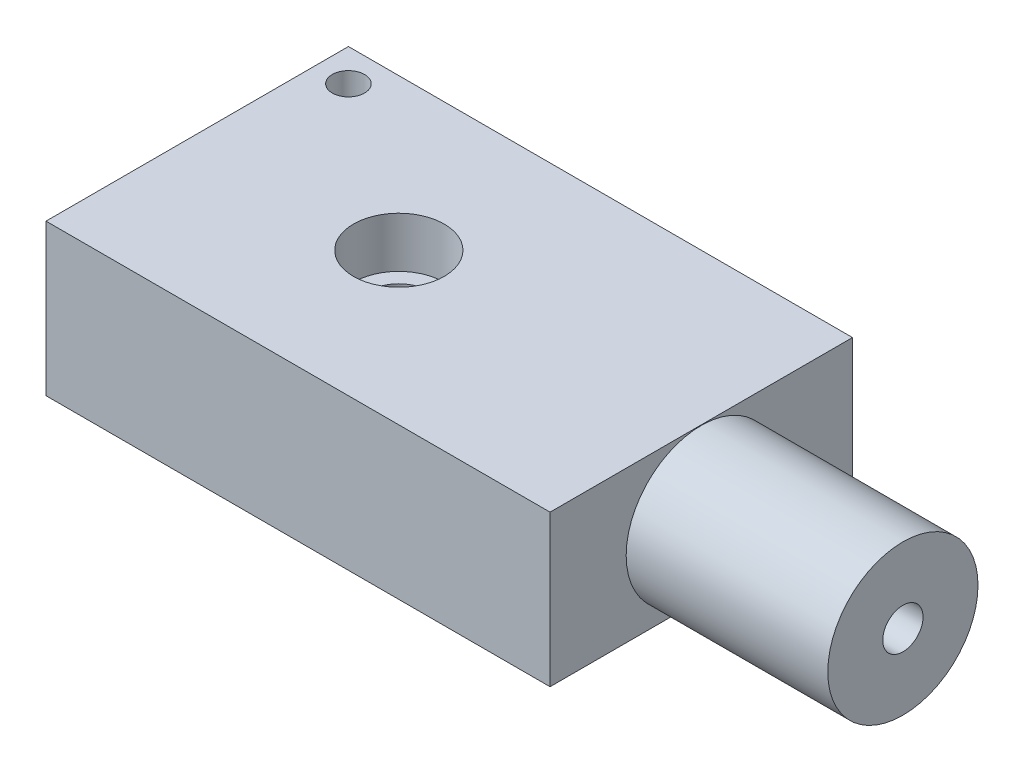
ISO-10303-21;
HEADER;
FILE_DESCRIPTION(('STEP AP214'),'2;1');
FILE_NAME('part.step','',(''),(''),'','','');
FILE_SCHEMA(('AUTOMOTIVE_DESIGN { 1 0 10303 214 1 1 1 1 }'));
ENDSEC;
DATA;
#1=APPLICATION_CONTEXT('core data for automotive mechanical design processes');
#2=APPLICATION_PROTOCOL_DEFINITION('international standard','automotive_design',2000,#1);
#3=PRODUCT_CONTEXT('',#1,'mechanical');
#4=PRODUCT('Part','Part','',(#3));
#5=PRODUCT_RELATED_PRODUCT_CATEGORY('part','',(#4));
#6=PRODUCT_DEFINITION_FORMATION('','',#4);
#7=PRODUCT_DEFINITION_CONTEXT('part definition',#1,'design');
#8=PRODUCT_DEFINITION('design','',#6,#7);
#9=PRODUCT_DEFINITION_SHAPE('','',#8);
#10=(LENGTH_UNIT() NAMED_UNIT(*) SI_UNIT(.MILLI.,.METRE.));
#11=(NAMED_UNIT(*) PLANE_ANGLE_UNIT() SI_UNIT($,.RADIAN.));
#12=(NAMED_UNIT(*) SI_UNIT($,.STERADIAN.) SOLID_ANGLE_UNIT());
#13=UNCERTAINTY_MEASURE_WITH_UNIT(LENGTH_MEASURE(1.E-05),#10,'distance_accuracy_value','');
#14=(GEOMETRIC_REPRESENTATION_CONTEXT(3) GLOBAL_UNCERTAINTY_ASSIGNED_CONTEXT((#13)) GLOBAL_UNIT_ASSIGNED_CONTEXT((#10,
#11,#12)) REPRESENTATION_CONTEXT('',''));
#15=CARTESIAN_POINT('',(0.,0.,0.));
#16=DIRECTION('',(0.,0.,1.));
#17=DIRECTION('',(1.,0.,0.));
#18=AXIS2_PLACEMENT_3D('',#15,#16,#17);
#19=CARTESIAN_POINT('',(-11.9651603980389,0.,5.0339617866108));
#20=DIRECTION('',(0.,1.,0.));
#21=DIRECTION('',(0.,0.,1.));
#22=AXIS2_PLACEMENT_3D('',#19,#20,#21);
#23=CYLINDRICAL_SURFACE('',#22,1.5);
#24=CARTESIAN_POINT('',(-11.9651603980389,5.,5.0339617866108));
#25=DIRECTION('',(0.,1.,0.));
#26=DIRECTION('',(0.,0.,1.));
#27=AXIS2_PLACEMENT_3D('',#24,#25,#26);
#28=CIRCLE('',#27,1.5);
#29=CARTESIAN_POINT('',(-11.9651603980389,5.,6.5339617866108));
#30=VERTEX_POINT('',#29);
#31=EDGE_CURVE('E422',#30,#30,#28,.T.);
#32=ORIENTED_EDGE('',*,*,#31,.T.);
#33=EDGE_LOOP('',(#32));
#34=FACE_BOUND('',#33,.T.);
#35=CARTESIAN_POINT('',(-11.9651603980389,2.5,5.0339617866108));
#36=DIRECTION('',(0.,-1.,0.));
#37=DIRECTION('',(0.,0.,-1.));
#38=AXIS2_PLACEMENT_3D('',#35,#36,#37);
#39=CIRCLE('',#38,1.5);
#40=CARTESIAN_POINT('',(-11.9651603980389,2.5,3.5339617866108));
#41=VERTEX_POINT('',#40);
#42=EDGE_CURVE('E37',#41,#41,#39,.F.);
#43=ORIENTED_EDGE('',*,*,#42,.F.);
#44=EDGE_LOOP('',(#43));
#45=FACE_BOUND('',#44,.T.);
#46=ADVANCED_FACE('F33',(#34,#45),#23,.F.);
#47=CARTESIAN_POINT('',(3.03483960196114,7.5,12.5339617866108));
#48=DIRECTION('',(-1.,0.,0.));
#49=DIRECTION('',(0.,0.,1.));
#50=AXIS2_PLACEMENT_3D('',#47,#48,#49);
#51=PLANE('',#50);
#52=DIRECTION('',(0.,0.,-1.));
#53=VECTOR('',#52,1.);
#54=CARTESIAN_POINT('',(3.03483960196114,0.,12.5339617866108));
#55=LINE('',#54,#53);
#56=CARTESIAN_POINT('',(3.03483960196114,0.,12.5339617866108));
#57=VERTEX_POINT('',#56);
#58=CARTESIAN_POINT('',(3.03483960196114,0.,-2.4660382133892));
#59=VERTEX_POINT('',#58);
#60=EDGE_CURVE('E156',#57,#59,#55,.T.);
#61=ORIENTED_EDGE('',*,*,#60,.T.);
#62=DIRECTION('',(0.,-1.,0.));
#63=VECTOR('',#62,1.);
#64=CARTESIAN_POINT('',(3.03483960196114,7.5,-2.4660382133892));
#65=LINE('',#64,#63);
#66=CARTESIAN_POINT('',(3.03483960196114,7.5,-2.4660382133892));
#67=VERTEX_POINT('',#66);
#68=EDGE_CURVE('E162',#67,#59,#65,.T.);
#69=ORIENTED_EDGE('',*,*,#68,.F.);
#70=DIRECTION('',(0.,0.,-1.));
#71=VECTOR('',#70,1.);
#72=CARTESIAN_POINT('',(3.03483960196114,7.5,12.5339617866108));
#73=LINE('',#72,#71);
#74=CARTESIAN_POINT('',(3.03483960196114,7.5,12.5339617866108));
#75=VERTEX_POINT('',#74);
#76=EDGE_CURVE('E150',#75,#67,#73,.T.);
#77=ORIENTED_EDGE('',*,*,#76,.F.);
#78=DIRECTION('',(0.,-1.,0.));
#79=VECTOR('',#78,1.);
#80=CARTESIAN_POINT('',(3.03483960196114,7.5,12.5339617866108));
#81=LINE('',#80,#79);
#82=EDGE_CURVE('E165',#75,#57,#81,.T.);
#83=ORIENTED_EDGE('',*,*,#82,.T.);
#84=EDGE_LOOP('',(#61,#69,#77,#83));
#85=FACE_BOUND('',#84,.T.);
#86=CARTESIAN_POINT('',(3.03483960196114,3.75,5.0339617866108));
#87=DIRECTION('',(-1.,0.,0.));
#88=DIRECTION('',(0.,0.,1.));
#89=AXIS2_PLACEMENT_3D('',#86,#87,#88);
#90=CIRCLE('',#89,3.725);
#91=CARTESIAN_POINT('',(3.03483960196114,3.75,8.7589617866108));
#92=VERTEX_POINT('',#91);
#93=EDGE_CURVE('E11',#92,#92,#90,.F.);
#94=ORIENTED_EDGE('',*,*,#93,.F.);
#95=EDGE_LOOP('',(#94));
#96=FACE_BOUND('',#95,.T.);
#97=ADVANCED_FACE('F212',(#85,#96),#51,.F.);
#98=CARTESIAN_POINT('',(-21.9651603980389,7.5,12.5339617866108));
#99=DIRECTION('',(1.,0.,0.));
#100=DIRECTION('',(0.,0.,-1.));
#101=AXIS2_PLACEMENT_3D('',#98,#99,#100);
#102=PLANE('',#101);
#103=DIRECTION('',(0.,-1.,0.));
#104=VECTOR('',#103,1.);
#105=CARTESIAN_POINT('',(-21.9651603980389,7.5,-2.4660382133892));
#106=LINE('',#105,#104);
#107=CARTESIAN_POINT('',(-21.9651603980389,7.5,-2.4660382133892));
#108=VERTEX_POINT('',#107);
#109=CARTESIAN_POINT('',(-21.9651603980389,5.75,-2.4660382133892));
#110=VERTEX_POINT('',#109);
#111=EDGE_CURVE('E159',#108,#110,#106,.T.);
#112=ORIENTED_EDGE('',*,*,#111,.T.);
#113=DIRECTION('',(0.,0.,-1.));
#114=VECTOR('',#113,1.);
#115=CARTESIAN_POINT('',(-21.9651603980389,5.75,-2.4660382133892));
#116=LINE('',#115,#114);
#117=CARTESIAN_POINT('',(-21.9651603980389,5.75,7.5339617866108));
#118=VERTEX_POINT('',#117);
#119=EDGE_CURVE('E126',#118,#110,#116,.T.);
#120=ORIENTED_EDGE('',*,*,#119,.F.);
#121=DIRECTION('',(0.,1.,0.));
#122=VECTOR('',#121,1.);
#123=CARTESIAN_POINT('',(-21.9651603980389,5.75,7.5339617866108));
#124=LINE('',#123,#122);
#125=CARTESIAN_POINT('',(-21.9651603980389,1.75,7.5339617866108));
#126=VERTEX_POINT('',#125);
#127=EDGE_CURVE('E191',#126,#118,#124,.T.);
#128=ORIENTED_EDGE('',*,*,#127,.F.);
#129=DIRECTION('',(0.,0.,1.));
#130=VECTOR('',#129,1.);
#131=CARTESIAN_POINT('',(-21.9651603980389,1.75,-2.4660382133892));
#132=LINE('',#131,#130);
#133=CARTESIAN_POINT('',(-21.9651603980389,1.75,-2.4660382133892));
#134=VERTEX_POINT('',#133);
#135=EDGE_CURVE('E175',#134,#126,#132,.T.);
#136=ORIENTED_EDGE('',*,*,#135,.F.);
#137=CARTESIAN_POINT('',(-21.9651603980389,0.,-2.4660382133892));
#138=VERTEX_POINT('',#137);
#139=EDGE_CURVE('E81',#134,#138,#106,.T.);
#140=ORIENTED_EDGE('',*,*,#139,.T.);
#141=DIRECTION('',(0.,0.,1.));
#142=VECTOR('',#141,1.);
#143=CARTESIAN_POINT('',(-21.9651603980389,0.,12.5339617866108));
#144=LINE('',#143,#142);
#145=CARTESIAN_POINT('',(-21.9651603980389,0.,12.5339617866108));
#146=VERTEX_POINT('',#145);
#147=EDGE_CURVE('E145',#138,#146,#144,.T.);
#148=ORIENTED_EDGE('',*,*,#147,.T.);
#149=DIRECTION('',(0.,-1.,0.));
#150=VECTOR('',#149,1.);
#151=CARTESIAN_POINT('',(-21.9651603980389,7.5,12.5339617866108));
#152=LINE('',#151,#150);
#153=CARTESIAN_POINT('',(-21.9651603980389,7.5,12.5339617866108));
#154=VERTEX_POINT('',#153);
#155=EDGE_CURVE('E42',#154,#146,#152,.T.);
#156=ORIENTED_EDGE('',*,*,#155,.F.);
#157=DIRECTION('',(0.,0.,1.));
#158=VECTOR('',#157,1.);
#159=CARTESIAN_POINT('',(-21.9651603980389,7.5,12.5339617866108));
#160=LINE('',#159,#158);
#161=EDGE_CURVE('E146',#108,#154,#160,.T.);
#162=ORIENTED_EDGE('',*,*,#161,.F.);
#163=EDGE_LOOP('',(#112,#120,#128,#136,#140,#148,#156,#162));
#164=FACE_BOUND('',#163,.T.);
#165=ADVANCED_FACE('F35',(#164),#102,.F.);
#166=CARTESIAN_POINT('',(-21.9651603980389,7.5,12.5339617866108));
#167=DIRECTION('',(0.,0.,-1.));
#168=DIRECTION('',(-1.,0.,0.));
#169=AXIS2_PLACEMENT_3D('',#166,#167,#168);
#170=PLANE('',#169);
#171=DIRECTION('',(1.,0.,0.));
#172=VECTOR('',#171,1.);
#173=CARTESIAN_POINT('',(-21.9651603980389,0.,12.5339617866108));
#174=LINE('',#173,#172);
#175=EDGE_CURVE('E154',#146,#57,#174,.T.);
#176=ORIENTED_EDGE('',*,*,#175,.T.);
#177=ORIENTED_EDGE('',*,*,#82,.F.);
#178=DIRECTION('',(1.,0.,0.));
#179=VECTOR('',#178,1.);
#180=CARTESIAN_POINT('',(-21.9651603980389,7.5,12.5339617866108));
#181=LINE('',#180,#179);
#182=EDGE_CURVE('E89',#154,#75,#181,.T.);
#183=ORIENTED_EDGE('',*,*,#182,.F.);
#184=ORIENTED_EDGE('',*,*,#155,.T.);
#185=EDGE_LOOP('',(#176,#177,#183,#184));
#186=FACE_BOUND('',#185,.T.);
#187=ADVANCED_FACE('F211',(#186),#170,.F.);
#188=CARTESIAN_POINT('',(-21.9651603980389,7.5,-2.4660382133892));
#189=DIRECTION('',(0.,0.,1.));
#190=DIRECTION('',(1.,0.,0.));
#191=AXIS2_PLACEMENT_3D('',#188,#189,#190);
#192=PLANE('',#191);
#193=DIRECTION('',(0.,-1.,0.));
#194=VECTOR('',#193,1.);
#195=CARTESIAN_POINT('',(-16.9651603980389,5.75,-2.4660382133892));
#196=LINE('',#195,#194);
#197=CARTESIAN_POINT('',(-16.9651603980389,5.75,-2.4660382133892));
#198=VERTEX_POINT('',#197);
#199=CARTESIAN_POINT('',(-16.9651603980389,1.75,-2.4660382133892));
#200=VERTEX_POINT('',#199);
#201=EDGE_CURVE('E120',#198,#200,#196,.T.);
#202=ORIENTED_EDGE('',*,*,#201,.F.);
#203=DIRECTION('',(-1.,0.,0.));
#204=VECTOR('',#203,1.);
#205=CARTESIAN_POINT('',(-16.9651603980389,5.75,-2.4660382133892));
#206=LINE('',#205,#204);
#207=EDGE_CURVE('E142',#198,#110,#206,.T.);
#208=ORIENTED_EDGE('',*,*,#207,.T.);
#209=ORIENTED_EDGE('',*,*,#111,.F.);
#210=DIRECTION('',(-1.,0.,0.));
#211=VECTOR('',#210,1.);
#212=CARTESIAN_POINT('',(-21.9651603980389,7.5,-2.4660382133892));
#213=LINE('',#212,#211);
#214=EDGE_CURVE('E59',#67,#108,#213,.T.);
#215=ORIENTED_EDGE('',*,*,#214,.F.);
#216=ORIENTED_EDGE('',*,*,#68,.T.);
#217=DIRECTION('',(-1.,0.,0.));
#218=VECTOR('',#217,1.);
#219=CARTESIAN_POINT('',(-21.9651603980389,0.,-2.4660382133892));
#220=LINE('',#219,#218);
#221=EDGE_CURVE('E148',#59,#138,#220,.T.);
#222=ORIENTED_EDGE('',*,*,#221,.T.);
#223=ORIENTED_EDGE('',*,*,#139,.F.);
#224=DIRECTION('',(-1.,0.,0.));
#225=VECTOR('',#224,1.);
#226=CARTESIAN_POINT('',(-16.9651603980389,1.75,-2.4660382133892));
#227=LINE('',#226,#225);
#228=EDGE_CURVE('E116',#200,#134,#227,.T.);
#229=ORIENTED_EDGE('',*,*,#228,.F.);
#230=EDGE_LOOP('',(#202,#208,#209,#215,#216,#222,#223,#229));
#231=FACE_BOUND('',#230,.T.);
#232=ADVANCED_FACE('F128',(#231),#192,.F.);
#233=CARTESIAN_POINT('',(0.,7.5,0.));
#234=DIRECTION('',(0.,-1.,0.));
#235=DIRECTION('',(0.,0.,-1.));
#236=AXIS2_PLACEMENT_3D('',#233,#234,#235);
#237=PLANE('',#236);
#238=CARTESIAN_POINT('',(-11.9651603980389,7.5,5.0339617866108));
#239=DIRECTION('',(0.,1.,0.));
#240=DIRECTION('',(0.,0.,1.));
#241=AXIS2_PLACEMENT_3D('',#238,#239,#240);
#242=CIRCLE('',#241,2.25);
#243=CARTESIAN_POINT('',(-11.9651603980389,7.5,7.2839617866108));
#244=VERTEX_POINT('',#243);
#245=EDGE_CURVE('E186',#244,#244,#242,.T.);
#246=ORIENTED_EDGE('',*,*,#245,.F.);
#247=EDGE_LOOP('',(#246));
#248=FACE_BOUND('',#247,.T.);
#249=CARTESIAN_POINT('',(-20.3651603980389,7.5,-0.866038213389199));
#250=DIRECTION('',(0.,1.,0.));
#251=DIRECTION('',(0.,0.,1.));
#252=AXIS2_PLACEMENT_3D('',#249,#250,#251);
#253=CIRCLE('',#252,0.800000000000003);
#254=CARTESIAN_POINT('',(-20.3651603980389,7.5,-0.0660382133891964));
#255=VERTEX_POINT('',#254);
#256=EDGE_CURVE('E178',#255,#255,#253,.T.);
#257=ORIENTED_EDGE('',*,*,#256,.F.);
#258=EDGE_LOOP('',(#257));
#259=FACE_BOUND('',#258,.T.);
#260=ORIENTED_EDGE('',*,*,#161,.T.);
#261=ORIENTED_EDGE('',*,*,#182,.T.);
#262=ORIENTED_EDGE('',*,*,#76,.T.);
#263=ORIENTED_EDGE('',*,*,#214,.T.);
#264=EDGE_LOOP('',(#260,#261,#262,#263));
#265=FACE_BOUND('',#264,.T.);
#266=ADVANCED_FACE('F214',(#248,#259,#265),#237,.F.);
#267=CARTESIAN_POINT('',(0.,0.,0.));
#268=DIRECTION('',(0.,-1.,0.));
#269=DIRECTION('',(0.,0.,-1.));
#270=AXIS2_PLACEMENT_3D('',#267,#268,#269);
#271=PLANE('',#270);
#272=CARTESIAN_POINT('',(-11.9651603980389,0.,5.0339617866108));
#273=DIRECTION('',(0.,-1.,0.));
#274=DIRECTION('',(0.,0.,-1.));
#275=AXIS2_PLACEMENT_3D('',#272,#273,#274);
#276=CIRCLE('',#275,2.25);
#277=CARTESIAN_POINT('',(-11.9651603980389,0.,2.7839617866108));
#278=VERTEX_POINT('',#277);
#279=EDGE_CURVE('E418',#278,#278,#276,.T.);
#280=ORIENTED_EDGE('',*,*,#279,.F.);
#281=EDGE_LOOP('',(#280));
#282=FACE_BOUND('',#281,.T.);
#283=CARTESIAN_POINT('',(-20.3651603980389,0.,-0.866038213389199));
#284=DIRECTION('',(0.,1.,0.));
#285=DIRECTION('',(0.,0.,1.));
#286=AXIS2_PLACEMENT_3D('',#283,#284,#285);
#287=CIRCLE('',#286,0.800000000000003);
#288=CARTESIAN_POINT('',(-20.3651603980389,0.,-0.0660382133891964));
#289=VERTEX_POINT('',#288);
#290=EDGE_CURVE('E171',#289,#289,#287,.T.);
#291=ORIENTED_EDGE('',*,*,#290,.T.);
#292=EDGE_LOOP('',(#291));
#293=FACE_BOUND('',#292,.T.);
#294=ORIENTED_EDGE('',*,*,#147,.F.);
#295=ORIENTED_EDGE('',*,*,#221,.F.);
#296=ORIENTED_EDGE('',*,*,#60,.F.);
#297=ORIENTED_EDGE('',*,*,#175,.F.);
#298=EDGE_LOOP('',(#294,#295,#296,#297));
#299=FACE_BOUND('',#298,.T.);
#300=ADVANCED_FACE('F210',(#282,#293,#299),#271,.T.);
#301=CARTESIAN_POINT('',(13.0348396019611,3.75,5.0339617866108));
#302=DIRECTION('',(-1.,0.,0.));
#303=DIRECTION('',(0.,0.,1.));
#304=AXIS2_PLACEMENT_3D('',#301,#302,#303);
#305=CYLINDRICAL_SURFACE('',#304,3.725);
#306=CARTESIAN_POINT('',(13.0348396019611,3.75,5.0339617866108));
#307=DIRECTION('',(1.,0.,0.));
#308=DIRECTION('',(0.,0.,-1.));
#309=AXIS2_PLACEMENT_3D('',#306,#307,#308);
#310=CIRCLE('',#309,3.725);
#311=CARTESIAN_POINT('',(13.0348396019611,3.75,1.3089617866108));
#312=VERTEX_POINT('',#311);
#313=EDGE_CURVE('E138',#312,#312,#310,.T.);
#314=ORIENTED_EDGE('',*,*,#313,.F.);
#315=EDGE_LOOP('',(#314));
#316=FACE_BOUND('',#315,.T.);
#317=ORIENTED_EDGE('',*,*,#93,.T.);
#318=EDGE_LOOP('',(#317));
#319=FACE_BOUND('',#318,.T.);
#320=ADVANCED_FACE('F222',(#316,#319),#305,.T.);
#321=CARTESIAN_POINT('',(13.0348396019611,3.75,5.0339617866108));
#322=DIRECTION('',(1.,0.,0.));
#323=DIRECTION('',(0.,0.,-1.));
#324=AXIS2_PLACEMENT_3D('',#321,#322,#323);
#325=PLANE('',#324);
#326=CARTESIAN_POINT('',(13.0348396019611,3.75,5.0339617866108));
#327=DIRECTION('',(1.,0.,0.));
#328=DIRECTION('',(0.,0.,-1.));
#329=AXIS2_PLACEMENT_3D('',#326,#327,#328);
#330=CIRCLE('',#329,1.);
#331=CARTESIAN_POINT('',(13.0348396019611,3.75,4.0339617866108));
#332=VERTEX_POINT('',#331);
#333=EDGE_CURVE('E139',#332,#332,#330,.T.);
#334=ORIENTED_EDGE('',*,*,#333,.F.);
#335=EDGE_LOOP('',(#334));
#336=FACE_BOUND('',#335,.T.);
#337=ORIENTED_EDGE('',*,*,#313,.T.);
#338=EDGE_LOOP('',(#337));
#339=FACE_BOUND('',#338,.T.);
#340=ADVANCED_FACE('F263',(#336,#339),#325,.T.);
#341=CARTESIAN_POINT('',(10.0348396019611,3.75,5.0339617866108));
#342=DIRECTION('',(1.,0.,0.));
#343=DIRECTION('',(0.,0.,-1.));
#344=AXIS2_PLACEMENT_3D('',#341,#342,#343);
#345=CYLINDRICAL_SURFACE('',#344,1.);
#346=CARTESIAN_POINT('',(10.0348396019611,3.75,5.0339617866108));
#347=DIRECTION('',(1.,0.,0.));
#348=DIRECTION('',(0.,0.,-1.));
#349=AXIS2_PLACEMENT_3D('',#346,#347,#348);
#350=CIRCLE('',#349,1.);
#351=CARTESIAN_POINT('',(10.0348396019611,3.75,4.0339617866108));
#352=VERTEX_POINT('',#351);
#353=EDGE_CURVE('E135',#352,#352,#350,.T.);
#354=ORIENTED_EDGE('',*,*,#353,.F.);
#355=EDGE_LOOP('',(#354));
#356=FACE_BOUND('',#355,.T.);
#357=ORIENTED_EDGE('',*,*,#333,.T.);
#358=EDGE_LOOP('',(#357));
#359=FACE_BOUND('',#358,.T.);
#360=ADVANCED_FACE('F259',(#356,#359),#345,.F.);
#361=CARTESIAN_POINT('',(10.0348396019611,3.75,5.0339617866108));
#362=DIRECTION('',(1.,0.,0.));
#363=DIRECTION('',(0.,0.,-1.));
#364=AXIS2_PLACEMENT_3D('',#361,#362,#363);
#365=PLANE('',#364);
#366=ORIENTED_EDGE('',*,*,#353,.T.);
#367=EDGE_LOOP('',(#366));
#368=FACE_BOUND('',#367,.T.);
#369=ADVANCED_FACE('F251',(#368),#365,.T.);
#370=CARTESIAN_POINT('',(-16.9651603980389,5.75,-2.4660382133892));
#371=DIRECTION('',(0.,1.,0.));
#372=DIRECTION('',(0.,0.,1.));
#373=AXIS2_PLACEMENT_3D('',#370,#371,#372);
#374=PLANE('',#373);
#375=CARTESIAN_POINT('',(-20.3651603980389,5.75,-0.866038213389199));
#376=DIRECTION('',(0.,1.,0.));
#377=DIRECTION('',(0.,0.,1.));
#378=AXIS2_PLACEMENT_3D('',#375,#376,#377);
#379=CIRCLE('',#378,0.800000000000003);
#380=CARTESIAN_POINT('',(-20.3651603980389,5.75,-0.0660382133891964));
#381=VERTEX_POINT('',#380);
#382=EDGE_CURVE('E170',#381,#381,#379,.T.);
#383=ORIENTED_EDGE('',*,*,#382,.T.);
#384=EDGE_LOOP('',(#383));
#385=FACE_BOUND('',#384,.T.);
#386=ORIENTED_EDGE('',*,*,#119,.T.);
#387=ORIENTED_EDGE('',*,*,#207,.F.);
#388=DIRECTION('',(0.,0.,-1.));
#389=VECTOR('',#388,1.);
#390=CARTESIAN_POINT('',(-16.9651603980389,5.75,-2.4660382133892));
#391=LINE('',#390,#389);
#392=CARTESIAN_POINT('',(-16.9651603980389,5.75,7.5339617866108));
#393=VERTEX_POINT('',#392);
#394=EDGE_CURVE('E50',#393,#198,#391,.T.);
#395=ORIENTED_EDGE('',*,*,#394,.F.);
#396=DIRECTION('',(-1.,0.,0.));
#397=VECTOR('',#396,1.);
#398=CARTESIAN_POINT('',(-16.9651603980389,5.75,7.5339617866108));
#399=LINE('',#398,#397);
#400=EDGE_CURVE('E130',#393,#118,#399,.T.);
#401=ORIENTED_EDGE('',*,*,#400,.T.);
#402=EDGE_LOOP('',(#386,#387,#395,#401));
#403=FACE_BOUND('',#402,.T.);
#404=ADVANCED_FACE('F196',(#385,#403),#374,.F.);
#405=CARTESIAN_POINT('',(-16.9651603980389,5.75,7.5339617866108));
#406=DIRECTION('',(0.,0.,1.));
#407=DIRECTION('',(1.,0.,0.));
#408=AXIS2_PLACEMENT_3D('',#405,#406,#407);
#409=PLANE('',#408);
#410=ORIENTED_EDGE('',*,*,#127,.T.);
#411=ORIENTED_EDGE('',*,*,#400,.F.);
#412=DIRECTION('',(0.,1.,0.));
#413=VECTOR('',#412,1.);
#414=CARTESIAN_POINT('',(-16.9651603980389,5.75,7.5339617866108));
#415=LINE('',#414,#413);
#416=CARTESIAN_POINT('',(-16.9651603980389,1.75,7.5339617866108));
#417=VERTEX_POINT('',#416);
#418=EDGE_CURVE('E119',#417,#393,#415,.T.);
#419=ORIENTED_EDGE('',*,*,#418,.F.);
#420=DIRECTION('',(-1.,0.,0.));
#421=VECTOR('',#420,1.);
#422=CARTESIAN_POINT('',(-16.9651603980389,1.75,7.5339617866108));
#423=LINE('',#422,#421);
#424=EDGE_CURVE('E117',#417,#126,#423,.T.);
#425=ORIENTED_EDGE('',*,*,#424,.T.);
#426=EDGE_LOOP('',(#410,#411,#419,#425));
#427=FACE_BOUND('',#426,.T.);
#428=ADVANCED_FACE('F200',(#427),#409,.F.);
#429=CARTESIAN_POINT('',(-16.9651603980389,1.75,-2.4660382133892));
#430=DIRECTION('',(0.,-1.,0.));
#431=DIRECTION('',(0.,0.,-1.));
#432=AXIS2_PLACEMENT_3D('',#429,#430,#431);
#433=PLANE('',#432);
#434=CARTESIAN_POINT('',(-20.3651603980389,1.75,-0.866038213389199));
#435=DIRECTION('',(0.,-1.,0.));
#436=DIRECTION('',(0.,0.,-1.));
#437=AXIS2_PLACEMENT_3D('',#434,#435,#436);
#438=CIRCLE('',#437,0.800000000000003);
#439=CARTESIAN_POINT('',(-20.3651603980389,1.75,-1.6660382133892));
#440=VERTEX_POINT('',#439);
#441=EDGE_CURVE('E168',#440,#440,#438,.T.);
#442=ORIENTED_EDGE('',*,*,#441,.T.);
#443=EDGE_LOOP('',(#442));
#444=FACE_BOUND('',#443,.T.);
#445=ORIENTED_EDGE('',*,*,#135,.T.);
#446=ORIENTED_EDGE('',*,*,#424,.F.);
#447=DIRECTION('',(0.,0.,1.));
#448=VECTOR('',#447,1.);
#449=CARTESIAN_POINT('',(-16.9651603980389,1.75,-2.4660382133892));
#450=LINE('',#449,#448);
#451=EDGE_CURVE('E112',#200,#417,#450,.T.);
#452=ORIENTED_EDGE('',*,*,#451,.F.);
#453=ORIENTED_EDGE('',*,*,#228,.T.);
#454=EDGE_LOOP('',(#445,#446,#452,#453));
#455=FACE_BOUND('',#454,.T.);
#456=ADVANCED_FACE('F114',(#444,#455),#433,.F.);
#457=CARTESIAN_POINT('',(-16.9651603980389,0.,0.));
#458=DIRECTION('',(-1.,0.,0.));
#459=DIRECTION('',(0.,0.,1.));
#460=AXIS2_PLACEMENT_3D('',#457,#458,#459);
#461=PLANE('',#460);
#462=ORIENTED_EDGE('',*,*,#201,.T.);
#463=ORIENTED_EDGE('',*,*,#451,.T.);
#464=ORIENTED_EDGE('',*,*,#418,.T.);
#465=ORIENTED_EDGE('',*,*,#394,.T.);
#466=EDGE_LOOP('',(#462,#463,#464,#465));
#467=FACE_BOUND('',#466,.T.);
#468=ADVANCED_FACE('F123',(#467),#461,.T.);
#469=CARTESIAN_POINT('',(-20.3651603980389,0.,-0.866038213389199));
#470=DIRECTION('',(0.,1.,0.));
#471=DIRECTION('',(0.,0.,1.));
#472=AXIS2_PLACEMENT_3D('',#469,#470,#471);
#473=CYLINDRICAL_SURFACE('',#472,0.800000000000003);
#474=ORIENTED_EDGE('',*,*,#290,.F.);
#475=EDGE_LOOP('',(#474));
#476=FACE_BOUND('',#475,.T.);
#477=ORIENTED_EDGE('',*,*,#441,.F.);
#478=EDGE_LOOP('',(#477));
#479=FACE_BOUND('',#478,.T.);
#480=ADVANCED_FACE('F245',(#476,#479),#473,.F.);
#481=ORIENTED_EDGE('',*,*,#256,.T.);
#482=EDGE_LOOP('',(#481));
#483=FACE_BOUND('',#482,.T.);
#484=ORIENTED_EDGE('',*,*,#382,.F.);
#485=EDGE_LOOP('',(#484));
#486=FACE_BOUND('',#485,.T.);
#487=ADVANCED_FACE('F242',(#483,#486),#473,.F.);
#488=CARTESIAN_POINT('',(-11.9651603980389,5.,5.0339617866108));
#489=DIRECTION('',(0.,1.,0.));
#490=DIRECTION('',(0.,0.,1.));
#491=AXIS2_PLACEMENT_3D('',#488,#489,#490);
#492=CYLINDRICAL_SURFACE('',#491,2.25);
#493=CARTESIAN_POINT('',(-11.9651603980389,5.,5.0339617866108));
#494=DIRECTION('',(0.,1.,0.));
#495=DIRECTION('',(0.,0.,1.));
#496=AXIS2_PLACEMENT_3D('',#493,#494,#495);
#497=CIRCLE('',#496,2.25);
#498=CARTESIAN_POINT('',(-11.9651603980389,5.,7.2839617866108));
#499=VERTEX_POINT('',#498);
#500=EDGE_CURVE('E183',#499,#499,#497,.T.);
#501=ORIENTED_EDGE('',*,*,#500,.F.);
#502=EDGE_LOOP('',(#501));
#503=FACE_BOUND('',#502,.T.);
#504=ORIENTED_EDGE('',*,*,#245,.T.);
#505=EDGE_LOOP('',(#504));
#506=FACE_BOUND('',#505,.T.);
#507=ADVANCED_FACE('F240',(#503,#506),#492,.F.);
#508=CARTESIAN_POINT('',(0.,5.,0.));
#509=DIRECTION('',(0.,1.,0.));
#510=DIRECTION('',(0.,0.,1.));
#511=AXIS2_PLACEMENT_3D('',#508,#509,#510);
#512=PLANE('',#511);
#513=ORIENTED_EDGE('',*,*,#31,.F.);
#514=EDGE_LOOP('',(#513));
#515=FACE_BOUND('',#514,.T.);
#516=ORIENTED_EDGE('',*,*,#500,.T.);
#517=EDGE_LOOP('',(#516));
#518=FACE_BOUND('',#517,.T.);
#519=ADVANCED_FACE('F324',(#515,#518),#512,.T.);
#520=CARTESIAN_POINT('',(-11.9651603980389,2.5,5.0339617866108));
#521=DIRECTION('',(0.,-1.,0.));
#522=DIRECTION('',(0.,0.,-1.));
#523=AXIS2_PLACEMENT_3D('',#520,#521,#522);
#524=PLANE('',#523);
#525=CARTESIAN_POINT('',(-11.9651603980389,2.5,5.0339617866108));
#526=DIRECTION('',(0.,-1.,0.));
#527=DIRECTION('',(0.,0.,-1.));
#528=AXIS2_PLACEMENT_3D('',#525,#526,#527);
#529=CIRCLE('',#528,2.25);
#530=CARTESIAN_POINT('',(-11.9651603980389,2.5,2.7839617866108));
#531=VERTEX_POINT('',#530);
#532=EDGE_CURVE('E415',#531,#531,#529,.T.);
#533=ORIENTED_EDGE('',*,*,#532,.T.);
#534=EDGE_LOOP('',(#533));
#535=FACE_BOUND('',#534,.T.);
#536=ORIENTED_EDGE('',*,*,#42,.T.);
#537=EDGE_LOOP('',(#536));
#538=FACE_BOUND('',#537,.T.);
#539=ADVANCED_FACE('F331',(#535,#538),#524,.T.);
#540=CARTESIAN_POINT('',(-11.9651603980389,2.5,5.0339617866108));
#541=DIRECTION('',(0.,-1.,0.));
#542=DIRECTION('',(0.,0.,-1.));
#543=AXIS2_PLACEMENT_3D('',#540,#541,#542);
#544=CYLINDRICAL_SURFACE('',#543,2.25);
#545=ORIENTED_EDGE('',*,*,#532,.F.);
#546=EDGE_LOOP('',(#545));
#547=FACE_BOUND('',#546,.T.);
#548=ORIENTED_EDGE('',*,*,#279,.T.);
#549=EDGE_LOOP('',(#548));
#550=FACE_BOUND('',#549,.T.);
#551=ADVANCED_FACE('F338',(#547,#550),#544,.F.);
#552=CLOSED_SHELL('',(#46,#97,#165,#187,#232,#266,#300,#320,#340,#360,#369,#404,#428,#456,#468,
#480,#487,#507,#519,#539,#551));
#553=MANIFOLD_SOLID_BREP('B2',#552);
#554=ADVANCED_BREP_SHAPE_REPRESENTATION('',(#18,#553),#14);
#555=SHAPE_DEFINITION_REPRESENTATION(#9,#554);
ENDSEC;
END-ISO-10303-21;
